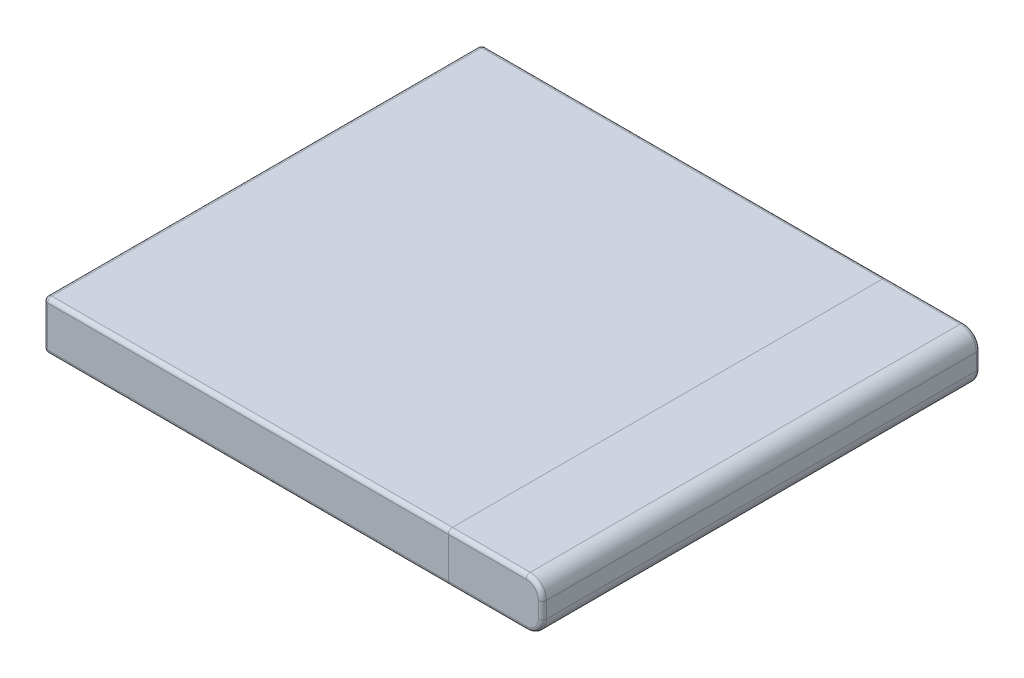
ISO-10303-21;
HEADER;
FILE_DESCRIPTION(('STEP AP214'),'2;1');
FILE_NAME('part.step','',(''),(''),'','','');
FILE_SCHEMA(('AUTOMOTIVE_DESIGN { 1 0 10303 214 1 1 1 1 }'));
ENDSEC;
DATA;
#1=APPLICATION_CONTEXT('core data for automotive mechanical design processes');
#2=APPLICATION_PROTOCOL_DEFINITION('international standard','automotive_design',2000,#1);
#3=PRODUCT_CONTEXT('',#1,'mechanical');
#4=PRODUCT('Part','Part','',(#3));
#5=PRODUCT_RELATED_PRODUCT_CATEGORY('part','',(#4));
#6=PRODUCT_DEFINITION_FORMATION('','',#4);
#7=PRODUCT_DEFINITION_CONTEXT('part definition',#1,'design');
#8=PRODUCT_DEFINITION('design','',#6,#7);
#9=PRODUCT_DEFINITION_SHAPE('','',#8);
#10=(LENGTH_UNIT() NAMED_UNIT(*) SI_UNIT(.MILLI.,.METRE.));
#11=(NAMED_UNIT(*) PLANE_ANGLE_UNIT() SI_UNIT($,.RADIAN.));
#12=(NAMED_UNIT(*) SI_UNIT($,.STERADIAN.) SOLID_ANGLE_UNIT());
#13=UNCERTAINTY_MEASURE_WITH_UNIT(LENGTH_MEASURE(1.E-05),#10,'distance_accuracy_value','');
#14=(GEOMETRIC_REPRESENTATION_CONTEXT(3) GLOBAL_UNCERTAINTY_ASSIGNED_CONTEXT((#13)) GLOBAL_UNIT_ASSIGNED_CONTEXT((#10,
#11,#12)) REPRESENTATION_CONTEXT('',''));
#15=CARTESIAN_POINT('',(0.,0.,0.));
#16=DIRECTION('',(0.,0.,1.));
#17=DIRECTION('',(1.,0.,0.));
#18=AXIS2_PLACEMENT_3D('',#15,#16,#17);
#19=CARTESIAN_POINT('',(36.55,-3.,27.));
#20=DIRECTION('',(0.,0.,-1.));
#21=DIRECTION('',(-1.,0.,0.));
#22=AXIS2_PLACEMENT_3D('',#19,#20,#21);
#23=PLANE('',#22);
#24=DIRECTION('',(0.,-1.,0.));
#25=VECTOR('',#24,1.);
#26=CARTESIAN_POINT('',(24.95,-3.,27.));
#27=LINE('',#26,#25);
#28=CARTESIAN_POINT('',(24.95,2.5,27.));
#29=VERTEX_POINT('',#28);
#30=CARTESIAN_POINT('',(24.95,-2.5,27.));
#31=VERTEX_POINT('',#30);
#32=EDGE_CURVE('E198',#29,#31,#27,.T.);
#33=ORIENTED_EDGE('',*,*,#32,.T.);
#34=DIRECTION('',(-1.,0.,0.));
#35=VECTOR('',#34,1.);
#36=CARTESIAN_POINT('',(36.55,-2.5,27.));
#37=LINE('',#36,#35);
#38=CARTESIAN_POINT('',(34.55,-2.5,27.));
#39=VERTEX_POINT('',#38);
#40=EDGE_CURVE('E162',#31,#39,#37,.F.);
#41=ORIENTED_EDGE('',*,*,#40,.T.);
#42=CARTESIAN_POINT('',(34.55,-1.,27.));
#43=DIRECTION('',(0.,0.,-1.));
#44=DIRECTION('',(-1.,0.,0.));
#45=AXIS2_PLACEMENT_3D('',#42,#43,#44);
#46=CIRCLE('',#45,1.5);
#47=CARTESIAN_POINT('',(36.05,-1.,27.));
#48=VERTEX_POINT('',#47);
#49=EDGE_CURVE('E236',#39,#48,#46,.F.);
#50=ORIENTED_EDGE('',*,*,#49,.T.);
#51=DIRECTION('',(0.,-1.,0.));
#52=VECTOR('',#51,1.);
#53=CARTESIAN_POINT('',(36.05,-3.,27.));
#54=LINE('',#53,#52);
#55=CARTESIAN_POINT('',(36.05,1.,27.));
#56=VERTEX_POINT('',#55);
#57=EDGE_CURVE('E234',#48,#56,#54,.F.);
#58=ORIENTED_EDGE('',*,*,#57,.T.);
#59=CARTESIAN_POINT('',(34.55,1.,27.));
#60=DIRECTION('',(0.,0.,-1.));
#61=DIRECTION('',(-1.,0.,0.));
#62=AXIS2_PLACEMENT_3D('',#59,#60,#61);
#63=CIRCLE('',#62,1.5);
#64=CARTESIAN_POINT('',(34.55,2.5,27.));
#65=VERTEX_POINT('',#64);
#66=EDGE_CURVE('E232',#56,#65,#63,.F.);
#67=ORIENTED_EDGE('',*,*,#66,.T.);
#68=DIRECTION('',(-1.,0.,0.));
#69=VECTOR('',#68,1.);
#70=CARTESIAN_POINT('',(36.55,2.5,27.));
#71=LINE('',#70,#69);
#72=EDGE_CURVE('E230',#65,#29,#71,.T.);
#73=ORIENTED_EDGE('',*,*,#72,.T.);
#74=EDGE_LOOP('',(#33,#41,#50,#58,#67,#73));
#75=FACE_BOUND('',#74,.T.);
#76=ADVANCED_FACE('F42',(#75),#23,.F.);
#77=CARTESIAN_POINT('',(36.55,-3.,27.));
#78=DIRECTION('',(0.,1.,0.));
#79=DIRECTION('',(0.,0.,1.));
#80=AXIS2_PLACEMENT_3D('',#77,#78,#79);
#81=PLANE('',#80);
#82=DIRECTION('',(0.,0.,-1.));
#83=VECTOR('',#82,1.);
#84=CARTESIAN_POINT('',(34.55,-3.,27.));
#85=LINE('',#84,#83);
#86=CARTESIAN_POINT('',(34.55,-3.,-26.5));
#87=VERTEX_POINT('',#86);
#88=CARTESIAN_POINT('',(34.55,-3.,26.5));
#89=VERTEX_POINT('',#88);
#90=EDGE_CURVE('E137',#87,#89,#85,.F.);
#91=ORIENTED_EDGE('',*,*,#90,.T.);
#92=DIRECTION('',(-1.,0.,0.));
#93=VECTOR('',#92,1.);
#94=CARTESIAN_POINT('',(36.55,-3.,26.5));
#95=LINE('',#94,#93);
#96=CARTESIAN_POINT('',(24.95,-3.,26.5));
#97=VERTEX_POINT('',#96);
#98=EDGE_CURVE('E143',#89,#97,#95,.T.);
#99=ORIENTED_EDGE('',*,*,#98,.T.);
#100=DIRECTION('',(0.,0.,-1.));
#101=VECTOR('',#100,1.);
#102=CARTESIAN_POINT('',(24.95,-3.,27.));
#103=LINE('',#102,#101);
#104=CARTESIAN_POINT('',(24.95,-3.,-26.5));
#105=VERTEX_POINT('',#104);
#106=EDGE_CURVE('E140',#97,#105,#103,.T.);
#107=ORIENTED_EDGE('',*,*,#106,.T.);
#108=DIRECTION('',(-1.,0.,0.));
#109=VECTOR('',#108,1.);
#110=CARTESIAN_POINT('',(36.55,-3.,-26.5));
#111=LINE('',#110,#109);
#112=EDGE_CURVE('E133',#105,#87,#111,.F.);
#113=ORIENTED_EDGE('',*,*,#112,.T.);
#114=EDGE_LOOP('',(#91,#99,#107,#113));
#115=FACE_BOUND('',#114,.T.);
#116=ADVANCED_FACE('F135',(#115),#81,.F.);
#117=CARTESIAN_POINT('',(36.55,-3.,-27.));
#118=DIRECTION('',(0.,0.,1.));
#119=DIRECTION('',(1.,0.,0.));
#120=AXIS2_PLACEMENT_3D('',#117,#118,#119);
#121=PLANE('',#120);
#122=CARTESIAN_POINT('',(34.55,-1.,-27.));
#123=DIRECTION('',(0.,0.,1.));
#124=DIRECTION('',(1.,0.,0.));
#125=AXIS2_PLACEMENT_3D('',#122,#123,#124);
#126=CIRCLE('',#125,1.5);
#127=CARTESIAN_POINT('',(36.05,-1.,-27.));
#128=VERTEX_POINT('',#127);
#129=CARTESIAN_POINT('',(34.55,-2.5,-27.));
#130=VERTEX_POINT('',#129);
#131=EDGE_CURVE('E59',#128,#130,#126,.F.);
#132=ORIENTED_EDGE('',*,*,#131,.T.);
#133=DIRECTION('',(-1.,0.,0.));
#134=VECTOR('',#133,1.);
#135=CARTESIAN_POINT('',(36.55,-2.5,-27.));
#136=LINE('',#135,#134);
#137=CARTESIAN_POINT('',(24.95,-2.5,-27.));
#138=VERTEX_POINT('',#137);
#139=EDGE_CURVE('E165',#130,#138,#136,.T.);
#140=ORIENTED_EDGE('',*,*,#139,.T.);
#141=DIRECTION('',(0.,1.,0.));
#142=VECTOR('',#141,1.);
#143=CARTESIAN_POINT('',(24.95,-3.,-27.));
#144=LINE('',#143,#142);
#145=CARTESIAN_POINT('',(24.95,2.5,-27.));
#146=VERTEX_POINT('',#145);
#147=EDGE_CURVE('E207',#138,#146,#144,.T.);
#148=ORIENTED_EDGE('',*,*,#147,.T.);
#149=DIRECTION('',(-1.,0.,0.));
#150=VECTOR('',#149,1.);
#151=CARTESIAN_POINT('',(36.55,2.5,-27.));
#152=LINE('',#151,#150);
#153=CARTESIAN_POINT('',(34.55,2.5,-27.));
#154=VERTEX_POINT('',#153);
#155=EDGE_CURVE('E248',#146,#154,#152,.F.);
#156=ORIENTED_EDGE('',*,*,#155,.T.);
#157=CARTESIAN_POINT('',(34.55,1.,-27.));
#158=DIRECTION('',(0.,0.,1.));
#159=DIRECTION('',(1.,0.,0.));
#160=AXIS2_PLACEMENT_3D('',#157,#158,#159);
#161=CIRCLE('',#160,1.5);
#162=CARTESIAN_POINT('',(36.05,1.,-27.));
#163=VERTEX_POINT('',#162);
#164=EDGE_CURVE('E250',#154,#163,#161,.F.);
#165=ORIENTED_EDGE('',*,*,#164,.T.);
#166=DIRECTION('',(0.,1.,0.));
#167=VECTOR('',#166,1.);
#168=CARTESIAN_POINT('',(36.05,-3.,-27.));
#169=LINE('',#168,#167);
#170=EDGE_CURVE('E64',#163,#128,#169,.F.);
#171=ORIENTED_EDGE('',*,*,#170,.T.);
#172=EDGE_LOOP('',(#132,#140,#148,#156,#165,#171));
#173=FACE_BOUND('',#172,.T.);
#174=ADVANCED_FACE('F267',(#173),#121,.F.);
#175=CARTESIAN_POINT('',(36.55,3.,27.));
#176=DIRECTION('',(0.,-1.,0.));
#177=DIRECTION('',(0.,0.,-1.));
#178=AXIS2_PLACEMENT_3D('',#175,#176,#177);
#179=PLANE('',#178);
#180=DIRECTION('',(0.,0.,1.));
#181=VECTOR('',#180,1.);
#182=CARTESIAN_POINT('',(24.95,3.,27.));
#183=LINE('',#182,#181);
#184=CARTESIAN_POINT('',(24.95,3.,-26.5));
#185=VERTEX_POINT('',#184);
#186=CARTESIAN_POINT('',(24.95,3.,26.5));
#187=VERTEX_POINT('',#186);
#188=EDGE_CURVE('E212',#185,#187,#183,.T.);
#189=ORIENTED_EDGE('',*,*,#188,.T.);
#190=DIRECTION('',(-1.,0.,0.));
#191=VECTOR('',#190,1.);
#192=CARTESIAN_POINT('',(36.55,3.,26.5));
#193=LINE('',#192,#191);
#194=CARTESIAN_POINT('',(34.55,3.,26.5));
#195=VERTEX_POINT('',#194);
#196=EDGE_CURVE('E12',#187,#195,#193,.F.);
#197=ORIENTED_EDGE('',*,*,#196,.T.);
#198=DIRECTION('',(0.,0.,1.));
#199=VECTOR('',#198,1.);
#200=CARTESIAN_POINT('',(34.55,3.,27.));
#201=LINE('',#200,#199);
#202=CARTESIAN_POINT('',(34.55,3.,-26.5));
#203=VERTEX_POINT('',#202);
#204=EDGE_CURVE('E144',#195,#203,#201,.F.);
#205=ORIENTED_EDGE('',*,*,#204,.T.);
#206=DIRECTION('',(-1.,0.,0.));
#207=VECTOR('',#206,1.);
#208=CARTESIAN_POINT('',(36.55,3.,-26.5));
#209=LINE('',#208,#207);
#210=EDGE_CURVE('E51',#203,#185,#209,.T.);
#211=ORIENTED_EDGE('',*,*,#210,.T.);
#212=EDGE_LOOP('',(#189,#197,#205,#211));
#213=FACE_BOUND('',#212,.T.);
#214=ADVANCED_FACE('F257',(#213),#179,.F.);
#215=CARTESIAN_POINT('',(36.55,3.,27.));
#216=DIRECTION('',(-1.,0.,0.));
#217=DIRECTION('',(0.,0.,1.));
#218=AXIS2_PLACEMENT_3D('',#215,#216,#217);
#219=PLANE('',#218);
#220=DIRECTION('',(0.,0.,1.));
#221=VECTOR('',#220,1.);
#222=CARTESIAN_POINT('',(36.55,1.,27.));
#223=LINE('',#222,#221);
#224=CARTESIAN_POINT('',(36.55,1.,-26.5));
#225=VERTEX_POINT('',#224);
#226=CARTESIAN_POINT('',(36.55,1.,26.5));
#227=VERTEX_POINT('',#226);
#228=EDGE_CURVE('E215',#225,#227,#223,.T.);
#229=ORIENTED_EDGE('',*,*,#228,.T.);
#230=DIRECTION('',(0.,-1.,0.));
#231=VECTOR('',#230,1.);
#232=CARTESIAN_POINT('',(36.55,3.,26.5));
#233=LINE('',#232,#231);
#234=CARTESIAN_POINT('',(36.55,-1.,26.5));
#235=VERTEX_POINT('',#234);
#236=EDGE_CURVE('E242',#227,#235,#233,.T.);
#237=ORIENTED_EDGE('',*,*,#236,.T.);
#238=DIRECTION('',(0.,0.,-1.));
#239=VECTOR('',#238,1.);
#240=CARTESIAN_POINT('',(36.55,-1.,27.));
#241=LINE('',#240,#239);
#242=CARTESIAN_POINT('',(36.55,-1.,-26.5));
#243=VERTEX_POINT('',#242);
#244=EDGE_CURVE('E154',#235,#243,#241,.T.);
#245=ORIENTED_EDGE('',*,*,#244,.T.);
#246=DIRECTION('',(0.,1.,0.));
#247=VECTOR('',#246,1.);
#248=CARTESIAN_POINT('',(36.55,3.,-26.5));
#249=LINE('',#248,#247);
#250=EDGE_CURVE('E240',#243,#225,#249,.T.);
#251=ORIENTED_EDGE('',*,*,#250,.T.);
#252=EDGE_LOOP('',(#229,#237,#245,#251));
#253=FACE_BOUND('',#252,.T.);
#254=ADVANCED_FACE('F280',(#253),#219,.F.);
#255=CARTESIAN_POINT('',(24.95,3.,27.));
#256=DIRECTION('',(-1.,0.,0.));
#257=DIRECTION('',(0.,0.,1.));
#258=AXIS2_PLACEMENT_3D('',#255,#256,#257);
#259=PLANE('',#258);
#260=ORIENTED_EDGE('',*,*,#106,.F.);
#261=CARTESIAN_POINT('',(24.95,-2.5,26.5));
#262=DIRECTION('',(-1.,0.,0.));
#263=DIRECTION('',(0.,0.,1.));
#264=AXIS2_PLACEMENT_3D('',#261,#262,#263);
#265=CIRCLE('',#264,0.5);
#266=EDGE_CURVE('E228',#97,#31,#265,.T.);
#267=ORIENTED_EDGE('',*,*,#266,.T.);
#268=ORIENTED_EDGE('',*,*,#32,.F.);
#269=CARTESIAN_POINT('',(24.95,2.5,26.5));
#270=DIRECTION('',(-1.,0.,0.));
#271=DIRECTION('',(0.,0.,1.));
#272=AXIS2_PLACEMENT_3D('',#269,#270,#271);
#273=CIRCLE('',#272,0.5);
#274=EDGE_CURVE('E224',#29,#187,#273,.T.);
#275=ORIENTED_EDGE('',*,*,#274,.T.);
#276=ORIENTED_EDGE('',*,*,#188,.F.);
#277=CARTESIAN_POINT('',(24.95,2.5,-26.5));
#278=DIRECTION('',(-1.,0.,0.));
#279=DIRECTION('',(0.,0.,1.));
#280=AXIS2_PLACEMENT_3D('',#277,#278,#279);
#281=CIRCLE('',#280,0.5);
#282=EDGE_CURVE('E222',#185,#146,#281,.T.);
#283=ORIENTED_EDGE('',*,*,#282,.T.);
#284=ORIENTED_EDGE('',*,*,#147,.F.);
#285=CARTESIAN_POINT('',(24.95,-2.5,-26.5));
#286=DIRECTION('',(-1.,0.,0.));
#287=DIRECTION('',(0.,0.,1.));
#288=AXIS2_PLACEMENT_3D('',#285,#286,#287);
#289=CIRCLE('',#288,0.5);
#290=EDGE_CURVE('E226',#138,#105,#289,.T.);
#291=ORIENTED_EDGE('',*,*,#290,.T.);
#292=EDGE_LOOP('',(#260,#267,#268,#275,#276,#283,#284,#291));
#293=FACE_BOUND('',#292,.T.);
#294=ADVANCED_FACE('F263',(#293),#259,.T.);
#295=CARTESIAN_POINT('',(34.55,-1.,27.));
#296=DIRECTION('',(0.,0.,-1.));
#297=DIRECTION('',(-1.,0.,0.));
#298=AXIS2_PLACEMENT_3D('',#295,#296,#297);
#299=CYLINDRICAL_SURFACE('',#298,2.);
#300=ORIENTED_EDGE('',*,*,#244,.F.);
#301=CARTESIAN_POINT('',(34.55,-1.,26.5));
#302=DIRECTION('',(0.,0.,-1.));
#303=DIRECTION('',(-1.,0.,0.));
#304=AXIS2_PLACEMENT_3D('',#301,#302,#303);
#305=CIRCLE('',#304,2.);
#306=EDGE_CURVE('E153',#235,#89,#305,.T.);
#307=ORIENTED_EDGE('',*,*,#306,.T.);
#308=ORIENTED_EDGE('',*,*,#90,.F.);
#309=CARTESIAN_POINT('',(34.55,-1.,-26.5));
#310=DIRECTION('',(0.,0.,1.));
#311=DIRECTION('',(1.,0.,0.));
#312=AXIS2_PLACEMENT_3D('',#309,#310,#311);
#313=CIRCLE('',#312,2.);
#314=EDGE_CURVE('E150',#87,#243,#313,.T.);
#315=ORIENTED_EDGE('',*,*,#314,.T.);
#316=EDGE_LOOP('',(#300,#307,#308,#315));
#317=FACE_BOUND('',#316,.T.);
#318=ADVANCED_FACE('F149',(#317),#299,.T.);
#319=CARTESIAN_POINT('',(34.55,1.,27.));
#320=DIRECTION('',(0.,0.,1.));
#321=DIRECTION('',(1.,0.,0.));
#322=AXIS2_PLACEMENT_3D('',#319,#320,#321);
#323=CYLINDRICAL_SURFACE('',#322,2.);
#324=ORIENTED_EDGE('',*,*,#204,.F.);
#325=CARTESIAN_POINT('',(34.55,1.,26.5));
#326=DIRECTION('',(0.,0.,-1.));
#327=DIRECTION('',(-1.,0.,0.));
#328=AXIS2_PLACEMENT_3D('',#325,#326,#327);
#329=CIRCLE('',#328,2.);
#330=EDGE_CURVE('E246',#195,#227,#329,.T.);
#331=ORIENTED_EDGE('',*,*,#330,.T.);
#332=ORIENTED_EDGE('',*,*,#228,.F.);
#333=CARTESIAN_POINT('',(34.55,1.,-26.5));
#334=DIRECTION('',(0.,0.,1.));
#335=DIRECTION('',(1.,0.,0.));
#336=AXIS2_PLACEMENT_3D('',#333,#334,#335);
#337=CIRCLE('',#336,2.);
#338=EDGE_CURVE('E244',#225,#203,#337,.T.);
#339=ORIENTED_EDGE('',*,*,#338,.T.);
#340=EDGE_LOOP('',(#324,#331,#332,#339));
#341=FACE_BOUND('',#340,.T.);
#342=ADVANCED_FACE('F278',(#341),#323,.T.);
#343=CARTESIAN_POINT('',(36.55,2.5,26.5));
#344=DIRECTION('',(-1.,0.,0.));
#345=DIRECTION('',(0.,0.,1.));
#346=AXIS2_PLACEMENT_3D('',#343,#344,#345);
#347=CYLINDRICAL_SURFACE('',#346,0.5);
#348=ORIENTED_EDGE('',*,*,#274,.F.);
#349=ORIENTED_EDGE('',*,*,#72,.F.);
#350=CARTESIAN_POINT('',(34.55,2.5,26.5));
#351=DIRECTION('',(1.,0.,0.));
#352=DIRECTION('',(0.,0.,-1.));
#353=AXIS2_PLACEMENT_3D('',#350,#351,#352);
#354=CIRCLE('',#353,0.5);
#355=EDGE_CURVE('E170',#195,#65,#354,.T.);
#356=ORIENTED_EDGE('',*,*,#355,.F.);
#357=ORIENTED_EDGE('',*,*,#196,.F.);
#358=EDGE_LOOP('',(#348,#349,#356,#357));
#359=FACE_BOUND('',#358,.T.);
#360=ADVANCED_FACE('F302',(#359),#347,.T.);
#361=CARTESIAN_POINT('',(34.55,1.,26.5));
#362=DIRECTION('',(0.,0.,-1.));
#363=DIRECTION('',(-1.,0.,0.));
#364=AXIS2_PLACEMENT_3D('',#361,#362,#363);
#365=TOROIDAL_SURFACE('',#364,1.5,0.5);
#366=ORIENTED_EDGE('',*,*,#355,.T.);
#367=ORIENTED_EDGE('',*,*,#66,.F.);
#368=CARTESIAN_POINT('',(36.05,1.,26.5));
#369=DIRECTION('',(0.,-1.,0.));
#370=DIRECTION('',(0.,0.,-1.));
#371=AXIS2_PLACEMENT_3D('',#368,#369,#370);
#372=CIRCLE('',#371,0.5);
#373=EDGE_CURVE('E189',#227,#56,#372,.T.);
#374=ORIENTED_EDGE('',*,*,#373,.F.);
#375=ORIENTED_EDGE('',*,*,#330,.F.);
#376=EDGE_LOOP('',(#366,#367,#374,#375));
#377=FACE_BOUND('',#376,.T.);
#378=ADVANCED_FACE('F275',(#377),#365,.T.);
#379=CARTESIAN_POINT('',(36.05,3.,26.5));
#380=DIRECTION('',(0.,-1.,0.));
#381=DIRECTION('',(0.,0.,-1.));
#382=AXIS2_PLACEMENT_3D('',#379,#380,#381);
#383=CYLINDRICAL_SURFACE('',#382,0.5);
#384=ORIENTED_EDGE('',*,*,#373,.T.);
#385=ORIENTED_EDGE('',*,*,#57,.F.);
#386=CARTESIAN_POINT('',(36.05,-1.,26.5));
#387=DIRECTION('',(0.,-1.,0.));
#388=DIRECTION('',(0.,0.,-1.));
#389=AXIS2_PLACEMENT_3D('',#386,#387,#388);
#390=CIRCLE('',#389,0.5);
#391=EDGE_CURVE('E183',#235,#48,#390,.T.);
#392=ORIENTED_EDGE('',*,*,#391,.F.);
#393=ORIENTED_EDGE('',*,*,#236,.F.);
#394=EDGE_LOOP('',(#384,#385,#392,#393));
#395=FACE_BOUND('',#394,.T.);
#396=ADVANCED_FACE('F273',(#395),#383,.T.);
#397=CARTESIAN_POINT('',(34.55,-1.,26.5));
#398=DIRECTION('',(0.,0.,-1.));
#399=DIRECTION('',(-1.,0.,0.));
#400=AXIS2_PLACEMENT_3D('',#397,#398,#399);
#401=TOROIDAL_SURFACE('',#400,1.5,0.5);
#402=ORIENTED_EDGE('',*,*,#391,.T.);
#403=ORIENTED_EDGE('',*,*,#49,.F.);
#404=CARTESIAN_POINT('',(34.55,-2.5,26.5));
#405=DIRECTION('',(-1.,0.,0.));
#406=DIRECTION('',(0.,0.,1.));
#407=AXIS2_PLACEMENT_3D('',#404,#405,#406);
#408=CIRCLE('',#407,0.5);
#409=EDGE_CURVE('E177',#89,#39,#408,.T.);
#410=ORIENTED_EDGE('',*,*,#409,.F.);
#411=ORIENTED_EDGE('',*,*,#306,.F.);
#412=EDGE_LOOP('',(#402,#403,#410,#411));
#413=FACE_BOUND('',#412,.T.);
#414=ADVANCED_FACE('F271',(#413),#401,.T.);
#415=CARTESIAN_POINT('',(36.55,-2.5,26.5));
#416=DIRECTION('',(-1.,0.,0.));
#417=DIRECTION('',(0.,0.,1.));
#418=AXIS2_PLACEMENT_3D('',#415,#416,#417);
#419=CYLINDRICAL_SURFACE('',#418,0.5);
#420=ORIENTED_EDGE('',*,*,#409,.T.);
#421=ORIENTED_EDGE('',*,*,#40,.F.);
#422=ORIENTED_EDGE('',*,*,#266,.F.);
#423=ORIENTED_EDGE('',*,*,#98,.F.);
#424=EDGE_LOOP('',(#420,#421,#422,#423));
#425=FACE_BOUND('',#424,.T.);
#426=ADVANCED_FACE('F268',(#425),#419,.T.);
#427=CARTESIAN_POINT('',(36.55,2.5,-26.5));
#428=DIRECTION('',(-1.,0.,0.));
#429=DIRECTION('',(0.,0.,1.));
#430=AXIS2_PLACEMENT_3D('',#427,#428,#429);
#431=CYLINDRICAL_SURFACE('',#430,0.5);
#432=ORIENTED_EDGE('',*,*,#282,.F.);
#433=ORIENTED_EDGE('',*,*,#210,.F.);
#434=CARTESIAN_POINT('',(34.55,2.5,-26.5));
#435=DIRECTION('',(1.,0.,0.));
#436=DIRECTION('',(0.,0.,-1.));
#437=AXIS2_PLACEMENT_3D('',#434,#435,#436);
#438=CIRCLE('',#437,0.5);
#439=EDGE_CURVE('E46',#154,#203,#438,.T.);
#440=ORIENTED_EDGE('',*,*,#439,.F.);
#441=ORIENTED_EDGE('',*,*,#155,.F.);
#442=EDGE_LOOP('',(#432,#433,#440,#441));
#443=FACE_BOUND('',#442,.T.);
#444=ADVANCED_FACE('F44',(#443),#431,.T.);
#445=CARTESIAN_POINT('',(34.55,1.,-26.5));
#446=DIRECTION('',(0.,0.,1.));
#447=DIRECTION('',(1.,0.,0.));
#448=AXIS2_PLACEMENT_3D('',#445,#446,#447);
#449=TOROIDAL_SURFACE('',#448,1.5,0.5);
#450=ORIENTED_EDGE('',*,*,#439,.T.);
#451=ORIENTED_EDGE('',*,*,#338,.F.);
#452=CARTESIAN_POINT('',(36.05,1.,-26.5));
#453=DIRECTION('',(0.,-1.,0.));
#454=DIRECTION('',(0.,0.,-1.));
#455=AXIS2_PLACEMENT_3D('',#452,#453,#454);
#456=CIRCLE('',#455,0.5);
#457=EDGE_CURVE('E167',#163,#225,#456,.T.);
#458=ORIENTED_EDGE('',*,*,#457,.F.);
#459=ORIENTED_EDGE('',*,*,#164,.F.);
#460=EDGE_LOOP('',(#450,#451,#458,#459));
#461=FACE_BOUND('',#460,.T.);
#462=ADVANCED_FACE('F283',(#461),#449,.T.);
#463=CARTESIAN_POINT('',(36.05,3.,-26.5));
#464=DIRECTION('',(0.,1.,0.));
#465=DIRECTION('',(0.,0.,1.));
#466=AXIS2_PLACEMENT_3D('',#463,#464,#465);
#467=CYLINDRICAL_SURFACE('',#466,0.5);
#468=ORIENTED_EDGE('',*,*,#457,.T.);
#469=ORIENTED_EDGE('',*,*,#250,.F.);
#470=CARTESIAN_POINT('',(36.05,-1.,-26.5));
#471=DIRECTION('',(0.,-1.,0.));
#472=DIRECTION('',(0.,0.,-1.));
#473=AXIS2_PLACEMENT_3D('',#470,#471,#472);
#474=CIRCLE('',#473,0.5);
#475=EDGE_CURVE('E161',#128,#243,#474,.T.);
#476=ORIENTED_EDGE('',*,*,#475,.F.);
#477=ORIENTED_EDGE('',*,*,#170,.F.);
#478=EDGE_LOOP('',(#468,#469,#476,#477));
#479=FACE_BOUND('',#478,.T.);
#480=ADVANCED_FACE('F281',(#479),#467,.T.);
#481=CARTESIAN_POINT('',(34.55,-1.,-26.5));
#482=DIRECTION('',(0.,0.,1.));
#483=DIRECTION('',(1.,0.,0.));
#484=AXIS2_PLACEMENT_3D('',#481,#482,#483);
#485=TOROIDAL_SURFACE('',#484,1.5,0.5);
#486=ORIENTED_EDGE('',*,*,#475,.T.);
#487=ORIENTED_EDGE('',*,*,#314,.F.);
#488=CARTESIAN_POINT('',(34.55,-2.5,-26.5));
#489=DIRECTION('',(-1.,0.,0.));
#490=DIRECTION('',(0.,0.,1.));
#491=AXIS2_PLACEMENT_3D('',#488,#489,#490);
#492=CIRCLE('',#491,0.5);
#493=EDGE_CURVE('E159',#130,#87,#492,.T.);
#494=ORIENTED_EDGE('',*,*,#493,.F.);
#495=ORIENTED_EDGE('',*,*,#131,.F.);
#496=EDGE_LOOP('',(#486,#487,#494,#495));
#497=FACE_BOUND('',#496,.T.);
#498=ADVANCED_FACE('F158',(#497),#485,.T.);
#499=CARTESIAN_POINT('',(36.55,-2.5,-26.5));
#500=DIRECTION('',(-1.,0.,0.));
#501=DIRECTION('',(0.,0.,1.));
#502=AXIS2_PLACEMENT_3D('',#499,#500,#501);
#503=CYLINDRICAL_SURFACE('',#502,0.5);
#504=ORIENTED_EDGE('',*,*,#493,.T.);
#505=ORIENTED_EDGE('',*,*,#112,.F.);
#506=ORIENTED_EDGE('',*,*,#290,.F.);
#507=ORIENTED_EDGE('',*,*,#139,.F.);
#508=EDGE_LOOP('',(#504,#505,#506,#507));
#509=FACE_BOUND('',#508,.T.);
#510=ADVANCED_FACE('F164',(#509),#503,.T.);
#511=CLOSED_SHELL('',(#76,#116,#174,#214,#254,#294,#318,#342,#360,#378,#396,#414,#426,#444,#462,
#480,#498,#510));
#512=MANIFOLD_SOLID_BREP('B2',#511);
#513=CARTESIAN_POINT('',(-24.95,-3.,27.));
#514=DIRECTION('',(-1.,0.,0.));
#515=DIRECTION('',(0.,0.,1.));
#516=AXIS2_PLACEMENT_3D('',#513,#514,#515);
#517=PLANE('',#516);
#518=DIRECTION('',(0.,0.,1.));
#519=VECTOR('',#518,1.);
#520=CARTESIAN_POINT('',(-24.95,-2.5,27.));
#521=LINE('',#520,#519);
#522=CARTESIAN_POINT('',(-24.95,-2.5,-26.5));
#523=VERTEX_POINT('',#522);
#524=CARTESIAN_POINT('',(-24.95,-2.5,26.5));
#525=VERTEX_POINT('',#524);
#526=EDGE_CURVE('E509',#523,#525,#521,.T.);
#527=ORIENTED_EDGE('',*,*,#526,.T.);
#528=DIRECTION('',(0.,1.,0.));
#529=VECTOR('',#528,1.);
#530=CARTESIAN_POINT('',(-24.95,-3.,26.5));
#531=LINE('',#530,#529);
#532=CARTESIAN_POINT('',(-24.95,2.5,26.5));
#533=VERTEX_POINT('',#532);
#534=EDGE_CURVE('E546',#525,#533,#531,.T.);
#535=ORIENTED_EDGE('',*,*,#534,.T.);
#536=DIRECTION('',(0.,0.,1.));
#537=VECTOR('',#536,1.);
#538=CARTESIAN_POINT('',(-24.95,2.5,-27.));
#539=LINE('',#538,#537);
#540=CARTESIAN_POINT('',(-24.95,2.5,-26.5));
#541=VERTEX_POINT('',#540);
#542=EDGE_CURVE('E512',#533,#541,#539,.F.);
#543=ORIENTED_EDGE('',*,*,#542,.T.);
#544=DIRECTION('',(0.,1.,0.));
#545=VECTOR('',#544,1.);
#546=CARTESIAN_POINT('',(-24.95,-3.,-26.5));
#547=LINE('',#546,#545);
#548=EDGE_CURVE('E505',#541,#523,#547,.F.);
#549=ORIENTED_EDGE('',*,*,#548,.T.);
#550=EDGE_LOOP('',(#527,#535,#543,#549));
#551=FACE_BOUND('',#550,.T.);
#552=ADVANCED_FACE('F429',(#551),#517,.T.);
#553=CARTESIAN_POINT('',(-24.95,-3.,-27.));
#554=DIRECTION('',(0.,0.,-1.));
#555=DIRECTION('',(-1.,0.,0.));
#556=AXIS2_PLACEMENT_3D('',#553,#554,#555);
#557=PLANE('',#556);
#558=DIRECTION('',(0.,1.,0.));
#559=VECTOR('',#558,1.);
#560=CARTESIAN_POINT('',(24.95,-3.,-27.));
#561=LINE('',#560,#559);
#562=CARTESIAN_POINT('',(24.95,-2.5,-27.));
#563=VERTEX_POINT('',#562);
#564=CARTESIAN_POINT('',(24.95,2.5,-27.));
#565=VERTEX_POINT('',#564);
#566=EDGE_CURVE('E538',#563,#565,#561,.T.);
#567=ORIENTED_EDGE('',*,*,#566,.F.);
#568=DIRECTION('',(-1.,0.,0.));
#569=VECTOR('',#568,1.);
#570=CARTESIAN_POINT('',(-24.95,-2.5,-27.));
#571=LINE('',#570,#569);
#572=CARTESIAN_POINT('',(-24.45,-2.5,-27.));
#573=VERTEX_POINT('',#572);
#574=EDGE_CURVE('E564',#563,#573,#571,.T.);
#575=ORIENTED_EDGE('',*,*,#574,.T.);
#576=DIRECTION('',(0.,1.,0.));
#577=VECTOR('',#576,1.);
#578=CARTESIAN_POINT('',(-24.45,-3.,-27.));
#579=LINE('',#578,#577);
#580=CARTESIAN_POINT('',(-24.45,2.5,-27.));
#581=VERTEX_POINT('',#580);
#582=EDGE_CURVE('E522',#573,#581,#579,.T.);
#583=ORIENTED_EDGE('',*,*,#582,.T.);
#584=DIRECTION('',(-1.,0.,0.));
#585=VECTOR('',#584,1.);
#586=CARTESIAN_POINT('',(24.95,2.5,-27.));
#587=LINE('',#586,#585);
#588=EDGE_CURVE('E561',#581,#565,#587,.F.);
#589=ORIENTED_EDGE('',*,*,#588,.T.);
#590=EDGE_LOOP('',(#567,#575,#583,#589));
#591=FACE_BOUND('',#590,.T.);
#592=ADVANCED_FACE('F633',(#591),#557,.T.);
#593=CARTESIAN_POINT('',(24.95,-3.,27.));
#594=DIRECTION('',(1.,0.,0.));
#595=DIRECTION('',(0.,0.,-1.));
#596=AXIS2_PLACEMENT_3D('',#593,#594,#595);
#597=PLANE('',#596);
#598=DIRECTION('',(0.,0.,-1.));
#599=VECTOR('',#598,1.);
#600=CARTESIAN_POINT('',(24.95,-3.,27.));
#601=LINE('',#600,#599);
#602=CARTESIAN_POINT('',(24.95,-3.,26.5));
#603=VERTEX_POINT('',#602);
#604=CARTESIAN_POINT('',(24.95,-3.,-26.5));
#605=VERTEX_POINT('',#604);
#606=EDGE_CURVE('E623',#603,#605,#601,.T.);
#607=ORIENTED_EDGE('',*,*,#606,.T.);
#608=CARTESIAN_POINT('',(24.95,-2.5,-26.5));
#609=DIRECTION('',(1.,0.,0.));
#610=DIRECTION('',(0.,0.,-1.));
#611=AXIS2_PLACEMENT_3D('',#608,#609,#610);
#612=CIRCLE('',#611,0.5);
#613=EDGE_CURVE('E40',#605,#563,#612,.T.);
#614=ORIENTED_EDGE('',*,*,#613,.T.);
#615=ORIENTED_EDGE('',*,*,#566,.T.);
#616=CARTESIAN_POINT('',(24.95,2.5,-26.5));
#617=DIRECTION('',(1.,0.,0.));
#618=DIRECTION('',(0.,0.,-1.));
#619=AXIS2_PLACEMENT_3D('',#616,#617,#618);
#620=CIRCLE('',#619,0.5);
#621=CARTESIAN_POINT('',(24.95,3.,-26.5));
#622=VERTEX_POINT('',#621);
#623=EDGE_CURVE('E438',#565,#622,#620,.T.);
#624=ORIENTED_EDGE('',*,*,#623,.T.);
#625=DIRECTION('',(0.,0.,-1.));
#626=VECTOR('',#625,1.);
#627=CARTESIAN_POINT('',(24.95,3.,27.));
#628=LINE('',#627,#626);
#629=CARTESIAN_POINT('',(24.95,3.,26.5));
#630=VERTEX_POINT('',#629);
#631=EDGE_CURVE('E619',#630,#622,#628,.T.);
#632=ORIENTED_EDGE('',*,*,#631,.F.);
#633=CARTESIAN_POINT('',(24.95,2.5,26.5));
#634=DIRECTION('',(1.,0.,0.));
#635=DIRECTION('',(0.,0.,-1.));
#636=AXIS2_PLACEMENT_3D('',#633,#634,#635);
#637=CIRCLE('',#636,0.5);
#638=CARTESIAN_POINT('',(24.95,2.5,27.));
#639=VERTEX_POINT('',#638);
#640=EDGE_CURVE('E570',#630,#639,#637,.T.);
#641=ORIENTED_EDGE('',*,*,#640,.T.);
#642=DIRECTION('',(0.,1.,0.));
#643=VECTOR('',#642,1.);
#644=CARTESIAN_POINT('',(24.95,-3.,27.));
#645=LINE('',#644,#643);
#646=CARTESIAN_POINT('',(24.95,-2.5,27.));
#647=VERTEX_POINT('',#646);
#648=EDGE_CURVE('E541',#647,#639,#645,.T.);
#649=ORIENTED_EDGE('',*,*,#648,.F.);
#650=CARTESIAN_POINT('',(24.95,-2.5,26.5));
#651=DIRECTION('',(1.,0.,0.));
#652=DIRECTION('',(0.,0.,-1.));
#653=AXIS2_PLACEMENT_3D('',#650,#651,#652);
#654=CIRCLE('',#653,0.5);
#655=EDGE_CURVE('E572',#647,#603,#654,.T.);
#656=ORIENTED_EDGE('',*,*,#655,.T.);
#657=EDGE_LOOP('',(#607,#614,#615,#624,#632,#641,#649,#656));
#658=FACE_BOUND('',#657,.T.);
#659=ADVANCED_FACE('F617',(#658),#597,.T.);
#660=CARTESIAN_POINT('',(-24.95,-3.,27.));
#661=DIRECTION('',(0.,0.,1.));
#662=DIRECTION('',(1.,0.,0.));
#663=AXIS2_PLACEMENT_3D('',#660,#661,#662);
#664=PLANE('',#663);
#665=DIRECTION('',(0.,1.,0.));
#666=VECTOR('',#665,1.);
#667=CARTESIAN_POINT('',(-24.45,-3.,27.));
#668=LINE('',#667,#666);
#669=CARTESIAN_POINT('',(-24.45,2.5,27.));
#670=VERTEX_POINT('',#669);
#671=CARTESIAN_POINT('',(-24.45,-2.5,27.));
#672=VERTEX_POINT('',#671);
#673=EDGE_CURVE('E550',#670,#672,#668,.F.);
#674=ORIENTED_EDGE('',*,*,#673,.T.);
#675=DIRECTION('',(1.,0.,0.));
#676=VECTOR('',#675,1.);
#677=CARTESIAN_POINT('',(-24.95,-2.5,27.));
#678=LINE('',#677,#676);
#679=EDGE_CURVE('E553',#672,#647,#678,.T.);
#680=ORIENTED_EDGE('',*,*,#679,.T.);
#681=ORIENTED_EDGE('',*,*,#648,.T.);
#682=DIRECTION('',(1.,0.,0.));
#683=VECTOR('',#682,1.);
#684=CARTESIAN_POINT('',(-24.95,2.5,27.));
#685=LINE('',#684,#683);
#686=EDGE_CURVE('E548',#639,#670,#685,.F.);
#687=ORIENTED_EDGE('',*,*,#686,.T.);
#688=EDGE_LOOP('',(#674,#680,#681,#687));
#689=FACE_BOUND('',#688,.T.);
#690=ADVANCED_FACE('F621',(#689),#664,.T.);
#691=CARTESIAN_POINT('',(-24.95,-3.,-27.));
#692=DIRECTION('',(0.,-1.,0.));
#693=DIRECTION('',(0.,0.,-1.));
#694=AXIS2_PLACEMENT_3D('',#691,#692,#693);
#695=PLANE('',#694);
#696=DIRECTION('',(0.,0.,1.));
#697=VECTOR('',#696,1.);
#698=CARTESIAN_POINT('',(-24.45,-3.,-27.));
#699=LINE('',#698,#697);
#700=CARTESIAN_POINT('',(-24.45,-3.,26.5));
#701=VERTEX_POINT('',#700);
#702=CARTESIAN_POINT('',(-24.45,-3.,-26.5));
#703=VERTEX_POINT('',#702);
#704=EDGE_CURVE('E446',#701,#703,#699,.F.);
#705=ORIENTED_EDGE('',*,*,#704,.T.);
#706=DIRECTION('',(-1.,0.,0.));
#707=VECTOR('',#706,1.);
#708=CARTESIAN_POINT('',(-24.95,-3.,-26.5));
#709=LINE('',#708,#707);
#710=EDGE_CURVE('E568',#703,#605,#709,.F.);
#711=ORIENTED_EDGE('',*,*,#710,.T.);
#712=ORIENTED_EDGE('',*,*,#606,.F.);
#713=DIRECTION('',(1.,0.,0.));
#714=VECTOR('',#713,1.);
#715=CARTESIAN_POINT('',(-24.95,-3.,26.5));
#716=LINE('',#715,#714);
#717=EDGE_CURVE('E451',#603,#701,#716,.F.);
#718=ORIENTED_EDGE('',*,*,#717,.T.);
#719=EDGE_LOOP('',(#705,#711,#712,#718));
#720=FACE_BOUND('',#719,.T.);
#721=ADVANCED_FACE('F636',(#720),#695,.T.);
#722=CARTESIAN_POINT('',(-24.95,3.,-27.));
#723=DIRECTION('',(0.,-1.,0.));
#724=DIRECTION('',(0.,0.,-1.));
#725=AXIS2_PLACEMENT_3D('',#722,#723,#724);
#726=PLANE('',#725);
#727=ORIENTED_EDGE('',*,*,#631,.T.);
#728=DIRECTION('',(-1.,0.,0.));
#729=VECTOR('',#728,1.);
#730=CARTESIAN_POINT('',(-24.95,3.,-26.5));
#731=LINE('',#730,#729);
#732=CARTESIAN_POINT('',(-24.45,3.,-26.5));
#733=VERTEX_POINT('',#732);
#734=EDGE_CURVE('E559',#622,#733,#731,.T.);
#735=ORIENTED_EDGE('',*,*,#734,.T.);
#736=DIRECTION('',(0.,0.,1.));
#737=VECTOR('',#736,1.);
#738=CARTESIAN_POINT('',(-24.45,3.,27.));
#739=LINE('',#738,#737);
#740=CARTESIAN_POINT('',(-24.45,3.,26.5));
#741=VERTEX_POINT('',#740);
#742=EDGE_CURVE('E557',#733,#741,#739,.T.);
#743=ORIENTED_EDGE('',*,*,#742,.T.);
#744=DIRECTION('',(1.,0.,0.));
#745=VECTOR('',#744,1.);
#746=CARTESIAN_POINT('',(24.95,3.,26.5));
#747=LINE('',#746,#745);
#748=EDGE_CURVE('E555',#741,#630,#747,.T.);
#749=ORIENTED_EDGE('',*,*,#748,.T.);
#750=EDGE_LOOP('',(#727,#735,#743,#749));
#751=FACE_BOUND('',#750,.T.);
#752=ADVANCED_FACE('F604',(#751),#726,.F.);
#753=CARTESIAN_POINT('',(-24.95,-2.5,-26.5));
#754=DIRECTION('',(-1.,0.,0.));
#755=DIRECTION('',(0.,0.,1.));
#756=AXIS2_PLACEMENT_3D('',#753,#754,#755);
#757=CYLINDRICAL_SURFACE('',#756,0.5);
#758=ORIENTED_EDGE('',*,*,#613,.F.);
#759=ORIENTED_EDGE('',*,*,#710,.F.);
#760=CARTESIAN_POINT('',(-24.45,-2.5,-26.5));
#761=DIRECTION('',(-1.,0.,0.));
#762=DIRECTION('',(0.,0.,1.));
#763=AXIS2_PLACEMENT_3D('',#760,#761,#762);
#764=CIRCLE('',#763,0.5);
#765=EDGE_CURVE('E433',#573,#703,#764,.T.);
#766=ORIENTED_EDGE('',*,*,#765,.F.);
#767=ORIENTED_EDGE('',*,*,#574,.F.);
#768=EDGE_LOOP('',(#758,#759,#766,#767));
#769=FACE_BOUND('',#768,.T.);
#770=ADVANCED_FACE('F431',(#769),#757,.T.);
#771=CARTESIAN_POINT('',(-24.45,-3.,-26.5));
#772=DIRECTION('',(0.,1.,0.));
#773=DIRECTION('',(0.,0.,1.));
#774=AXIS2_PLACEMENT_3D('',#771,#772,#773);
#775=CYLINDRICAL_SURFACE('',#774,0.5);
#776=CARTESIAN_POINT('',(-24.45,2.5,-26.5));
#777=DIRECTION('',(0.,1.,0.));
#778=DIRECTION('',(0.,0.,1.));
#779=AXIS2_PLACEMENT_3D('',#776,#777,#778);
#780=CIRCLE('',#779,0.5);
#781=EDGE_CURVE('E526',#581,#541,#780,.T.);
#782=ORIENTED_EDGE('',*,*,#781,.F.);
#783=ORIENTED_EDGE('',*,*,#582,.F.);
#784=CARTESIAN_POINT('',(-24.45,-2.5,-26.5));
#785=DIRECTION('',(0.,-1.,0.));
#786=DIRECTION('',(0.,0.,-1.));
#787=AXIS2_PLACEMENT_3D('',#784,#785,#786);
#788=CIRCLE('',#787,0.5);
#789=EDGE_CURVE('E519',#523,#573,#788,.T.);
#790=ORIENTED_EDGE('',*,*,#789,.F.);
#791=ORIENTED_EDGE('',*,*,#548,.F.);
#792=EDGE_LOOP('',(#782,#783,#790,#791));
#793=FACE_BOUND('',#792,.T.);
#794=ADVANCED_FACE('F521',(#793),#775,.T.);
#795=CARTESIAN_POINT('',(-24.95,2.5,-26.5));
#796=DIRECTION('',(1.,0.,0.));
#797=DIRECTION('',(0.,0.,-1.));
#798=AXIS2_PLACEMENT_3D('',#795,#796,#797);
#799=CYLINDRICAL_SURFACE('',#798,0.5);
#800=ORIENTED_EDGE('',*,*,#623,.F.);
#801=ORIENTED_EDGE('',*,*,#588,.F.);
#802=CARTESIAN_POINT('',(-24.45,2.5,-26.5));
#803=DIRECTION('',(-1.,0.,0.));
#804=DIRECTION('',(0.,0.,1.));
#805=AXIS2_PLACEMENT_3D('',#802,#803,#804);
#806=CIRCLE('',#805,0.5);
#807=EDGE_CURVE('E531',#733,#581,#806,.T.);
#808=ORIENTED_EDGE('',*,*,#807,.F.);
#809=ORIENTED_EDGE('',*,*,#734,.F.);
#810=EDGE_LOOP('',(#800,#801,#808,#809));
#811=FACE_BOUND('',#810,.T.);
#812=ADVANCED_FACE('F629',(#811),#799,.T.);
#813=CARTESIAN_POINT('',(-24.45,-2.5,-26.5));
#814=DIRECTION('',(0.,0.,1.));
#815=DIRECTION('',(1.,0.,0.));
#816=AXIS2_PLACEMENT_3D('',#813,#814,#815);
#817=SPHERICAL_SURFACE('',#816,0.5);
#818=ORIENTED_EDGE('',*,*,#789,.T.);
#819=ORIENTED_EDGE('',*,*,#765,.T.);
#820=CARTESIAN_POINT('',(-24.45,-2.5,-26.5));
#821=DIRECTION('',(0.,0.,-1.));
#822=DIRECTION('',(-1.,0.,0.));
#823=AXIS2_PLACEMENT_3D('',#820,#821,#822);
#824=CIRCLE('',#823,0.5);
#825=EDGE_CURVE('E528',#523,#703,#824,.F.);
#826=ORIENTED_EDGE('',*,*,#825,.F.);
#827=EDGE_LOOP('',(#818,#819,#826));
#828=FACE_BOUND('',#827,.T.);
#829=ADVANCED_FACE('F529',(#828),#817,.T.);
#830=CARTESIAN_POINT('',(-24.45,2.5,-26.5));
#831=DIRECTION('',(0.,0.,1.));
#832=DIRECTION('',(1.,0.,0.));
#833=AXIS2_PLACEMENT_3D('',#830,#831,#832);
#834=SPHERICAL_SURFACE('',#833,0.5);
#835=ORIENTED_EDGE('',*,*,#807,.T.);
#836=ORIENTED_EDGE('',*,*,#781,.T.);
#837=CARTESIAN_POINT('',(-24.45,2.5,-26.5));
#838=DIRECTION('',(0.,0.,-1.));
#839=DIRECTION('',(-1.,0.,0.));
#840=AXIS2_PLACEMENT_3D('',#837,#838,#839);
#841=CIRCLE('',#840,0.5);
#842=EDGE_CURVE('E532',#733,#541,#841,.F.);
#843=ORIENTED_EDGE('',*,*,#842,.F.);
#844=EDGE_LOOP('',(#835,#836,#843));
#845=FACE_BOUND('',#844,.T.);
#846=ADVANCED_FACE('F595',(#845),#834,.T.);
#847=CARTESIAN_POINT('',(-24.95,-2.5,26.5));
#848=DIRECTION('',(1.,0.,0.));
#849=DIRECTION('',(0.,0.,-1.));
#850=AXIS2_PLACEMENT_3D('',#847,#848,#849);
#851=CYLINDRICAL_SURFACE('',#850,0.5);
#852=ORIENTED_EDGE('',*,*,#655,.F.);
#853=ORIENTED_EDGE('',*,*,#679,.F.);
#854=CARTESIAN_POINT('',(-24.45,-2.5,26.5));
#855=DIRECTION('',(-1.,0.,0.));
#856=DIRECTION('',(0.,0.,1.));
#857=AXIS2_PLACEMENT_3D('',#854,#855,#856);
#858=CIRCLE('',#857,0.5);
#859=EDGE_CURVE('E586',#701,#672,#858,.T.);
#860=ORIENTED_EDGE('',*,*,#859,.F.);
#861=ORIENTED_EDGE('',*,*,#717,.F.);
#862=EDGE_LOOP('',(#852,#853,#860,#861));
#863=FACE_BOUND('',#862,.T.);
#864=ADVANCED_FACE('F639',(#863),#851,.T.);
#865=CARTESIAN_POINT('',(-24.45,-2.5,27.));
#866=DIRECTION('',(0.,0.,1.));
#867=DIRECTION('',(1.,0.,0.));
#868=AXIS2_PLACEMENT_3D('',#865,#866,#867);
#869=CYLINDRICAL_SURFACE('',#868,0.5);
#870=ORIENTED_EDGE('',*,*,#825,.T.);
#871=ORIENTED_EDGE('',*,*,#704,.F.);
#872=CARTESIAN_POINT('',(-24.45,-2.5,26.5));
#873=DIRECTION('',(0.,0.,1.));
#874=DIRECTION('',(1.,0.,0.));
#875=AXIS2_PLACEMENT_3D('',#872,#873,#874);
#876=CIRCLE('',#875,0.5);
#877=EDGE_CURVE('E536',#525,#701,#876,.T.);
#878=ORIENTED_EDGE('',*,*,#877,.F.);
#879=ORIENTED_EDGE('',*,*,#526,.F.);
#880=EDGE_LOOP('',(#870,#871,#878,#879));
#881=FACE_BOUND('',#880,.T.);
#882=ADVANCED_FACE('F534',(#881),#869,.T.);
#883=CARTESIAN_POINT('',(-24.45,2.5,-27.));
#884=DIRECTION('',(0.,0.,-1.));
#885=DIRECTION('',(-1.,0.,0.));
#886=AXIS2_PLACEMENT_3D('',#883,#884,#885);
#887=CYLINDRICAL_SURFACE('',#886,0.5);
#888=ORIENTED_EDGE('',*,*,#842,.T.);
#889=ORIENTED_EDGE('',*,*,#542,.F.);
#890=CARTESIAN_POINT('',(-24.45,2.5,26.5));
#891=DIRECTION('',(0.,0.,1.));
#892=DIRECTION('',(1.,0.,0.));
#893=AXIS2_PLACEMENT_3D('',#890,#891,#892);
#894=CIRCLE('',#893,0.5);
#895=EDGE_CURVE('E582',#741,#533,#894,.T.);
#896=ORIENTED_EDGE('',*,*,#895,.F.);
#897=ORIENTED_EDGE('',*,*,#742,.F.);
#898=EDGE_LOOP('',(#888,#889,#896,#897));
#899=FACE_BOUND('',#898,.T.);
#900=ADVANCED_FACE('F599',(#899),#887,.T.);
#901=CARTESIAN_POINT('',(-24.95,2.5,26.5));
#902=DIRECTION('',(-1.,0.,0.));
#903=DIRECTION('',(0.,0.,1.));
#904=AXIS2_PLACEMENT_3D('',#901,#902,#903);
#905=CYLINDRICAL_SURFACE('',#904,0.5);
#906=ORIENTED_EDGE('',*,*,#640,.F.);
#907=ORIENTED_EDGE('',*,*,#748,.F.);
#908=CARTESIAN_POINT('',(-24.45,2.5,26.5));
#909=DIRECTION('',(-1.,0.,0.));
#910=DIRECTION('',(0.,0.,1.));
#911=AXIS2_PLACEMENT_3D('',#908,#909,#910);
#912=CIRCLE('',#911,0.5);
#913=EDGE_CURVE('E579',#670,#741,#912,.T.);
#914=ORIENTED_EDGE('',*,*,#913,.F.);
#915=ORIENTED_EDGE('',*,*,#686,.F.);
#916=EDGE_LOOP('',(#906,#907,#914,#915));
#917=FACE_BOUND('',#916,.T.);
#918=ADVANCED_FACE('F610',(#917),#905,.T.);
#919=CARTESIAN_POINT('',(-24.45,-2.5,26.5));
#920=DIRECTION('',(0.,0.,1.));
#921=DIRECTION('',(1.,0.,0.));
#922=AXIS2_PLACEMENT_3D('',#919,#920,#921);
#923=SPHERICAL_SURFACE('',#922,0.5);
#924=ORIENTED_EDGE('',*,*,#877,.T.);
#925=ORIENTED_EDGE('',*,*,#859,.T.);
#926=CARTESIAN_POINT('',(-24.45,-2.5,26.5));
#927=DIRECTION('',(0.,-1.,0.));
#928=DIRECTION('',(0.,0.,-1.));
#929=AXIS2_PLACEMENT_3D('',#926,#927,#928);
#930=CIRCLE('',#929,0.5);
#931=EDGE_CURVE('E577',#525,#672,#930,.F.);
#932=ORIENTED_EDGE('',*,*,#931,.F.);
#933=EDGE_LOOP('',(#924,#925,#932));
#934=FACE_BOUND('',#933,.T.);
#935=ADVANCED_FACE('F641',(#934),#923,.T.);
#936=CARTESIAN_POINT('',(-24.45,2.5,26.5));
#937=DIRECTION('',(0.,0.,1.));
#938=DIRECTION('',(1.,0.,0.));
#939=AXIS2_PLACEMENT_3D('',#936,#937,#938);
#940=SPHERICAL_SURFACE('',#939,0.5);
#941=ORIENTED_EDGE('',*,*,#913,.T.);
#942=ORIENTED_EDGE('',*,*,#895,.T.);
#943=CARTESIAN_POINT('',(-24.45,2.5,26.5));
#944=DIRECTION('',(0.,1.,0.));
#945=DIRECTION('',(0.,0.,1.));
#946=AXIS2_PLACEMENT_3D('',#943,#944,#945);
#947=CIRCLE('',#946,0.5);
#948=EDGE_CURVE('E575',#670,#533,#947,.F.);
#949=ORIENTED_EDGE('',*,*,#948,.F.);
#950=EDGE_LOOP('',(#941,#942,#949));
#951=FACE_BOUND('',#950,.T.);
#952=ADVANCED_FACE('F647',(#951),#940,.T.);
#953=CARTESIAN_POINT('',(-24.45,-3.,26.5));
#954=DIRECTION('',(0.,1.,0.));
#955=DIRECTION('',(0.,0.,1.));
#956=AXIS2_PLACEMENT_3D('',#953,#954,#955);
#957=CYLINDRICAL_SURFACE('',#956,0.5);
#958=ORIENTED_EDGE('',*,*,#931,.T.);
#959=ORIENTED_EDGE('',*,*,#673,.F.);
#960=ORIENTED_EDGE('',*,*,#948,.T.);
#961=ORIENTED_EDGE('',*,*,#534,.F.);
#962=EDGE_LOOP('',(#958,#959,#960,#961));
#963=FACE_BOUND('',#962,.T.);
#964=ADVANCED_FACE('F644',(#963),#957,.T.);
#965=CLOSED_SHELL('',(#552,#592,#659,#690,#721,#752,#770,#794,#812,#829,#846,#864,#882,#900,
#918,#935,#952,#964));
#966=MANIFOLD_SOLID_BREP('B6',#965);
#967=ADVANCED_BREP_SHAPE_REPRESENTATION('',(#18,#512,#966),#14);
#968=SHAPE_DEFINITION_REPRESENTATION(#9,#967);
ENDSEC;
END-ISO-10303-21;
